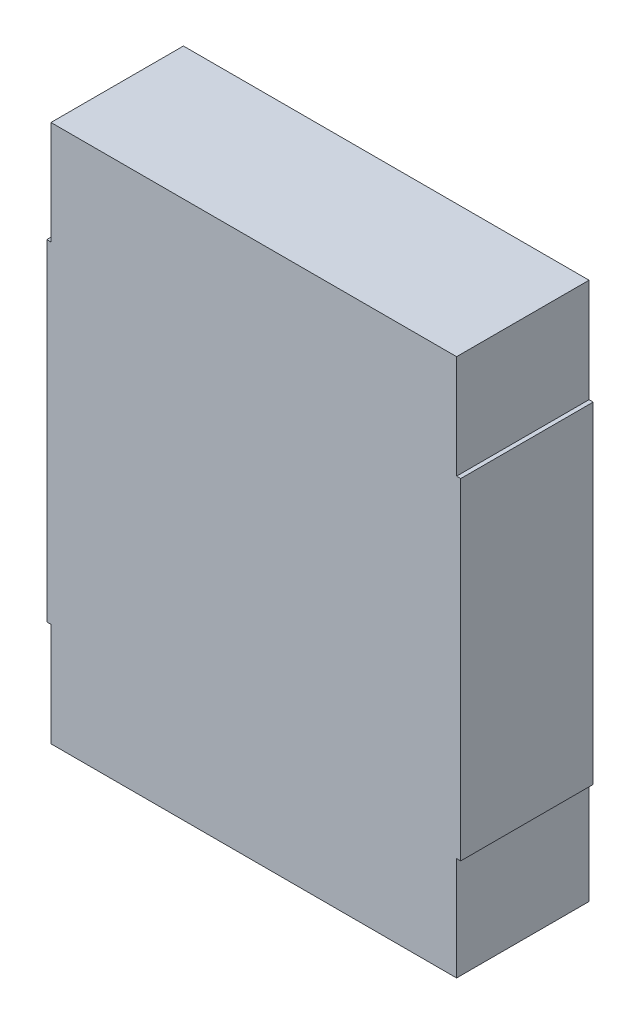
ISO-10303-21;
HEADER;
FILE_DESCRIPTION(('STEP AP214'),'2;1');
FILE_NAME('part.step','',(''),(''),'','','');
FILE_SCHEMA(('AUTOMOTIVE_DESIGN { 1 0 10303 214 1 1 1 1 }'));
ENDSEC;
DATA;
#1=APPLICATION_CONTEXT('core data for automotive mechanical design processes');
#2=APPLICATION_PROTOCOL_DEFINITION('international standard','automotive_design',2000,#1);
#3=PRODUCT_CONTEXT('',#1,'mechanical');
#4=PRODUCT('Part','Part','',(#3));
#5=PRODUCT_RELATED_PRODUCT_CATEGORY('part','',(#4));
#6=PRODUCT_DEFINITION_FORMATION('','',#4);
#7=PRODUCT_DEFINITION_CONTEXT('part definition',#1,'design');
#8=PRODUCT_DEFINITION('design','',#6,#7);
#9=PRODUCT_DEFINITION_SHAPE('','',#8);
#10=(LENGTH_UNIT() NAMED_UNIT(*) SI_UNIT(.MILLI.,.METRE.));
#11=(NAMED_UNIT(*) PLANE_ANGLE_UNIT() SI_UNIT($,.RADIAN.));
#12=(NAMED_UNIT(*) SI_UNIT($,.STERADIAN.) SOLID_ANGLE_UNIT());
#13=UNCERTAINTY_MEASURE_WITH_UNIT(LENGTH_MEASURE(1.E-05),#10,'distance_accuracy_value','');
#14=(GEOMETRIC_REPRESENTATION_CONTEXT(3) GLOBAL_UNCERTAINTY_ASSIGNED_CONTEXT((#13)) GLOBAL_UNIT_ASSIGNED_CONTEXT((#10,
#11,#12)) REPRESENTATION_CONTEXT('',''));
#15=CARTESIAN_POINT('',(0.,0.,0.));
#16=DIRECTION('',(0.,0.,1.));
#17=DIRECTION('',(1.,0.,0.));
#18=AXIS2_PLACEMENT_3D('',#15,#16,#17);
#19=CARTESIAN_POINT('',(-2.5,-2.,1.6));
#20=DIRECTION('',(1.,0.,0.));
#21=DIRECTION('',(0.,0.,-1.));
#22=AXIS2_PLACEMENT_3D('',#19,#20,#21);
#23=PLANE('',#22);
#24=DIRECTION('',(0.,-1.,0.));
#25=VECTOR('',#24,1.);
#26=CARTESIAN_POINT('',(-2.5,-2.,0.));
#27=LINE('',#26,#25);
#28=CARTESIAN_POINT('',(-2.5,2.,0.));
#29=VERTEX_POINT('',#28);
#30=CARTESIAN_POINT('',(-2.5,-2.,0.));
#31=VERTEX_POINT('',#30);
#32=EDGE_CURVE('E154',#29,#31,#27,.T.);
#33=ORIENTED_EDGE('',*,*,#32,.T.);
#34=DIRECTION('',(0.,0.,-1.));
#35=VECTOR('',#34,1.);
#36=CARTESIAN_POINT('',(-2.5,-2.,1.6));
#37=LINE('',#36,#35);
#38=CARTESIAN_POINT('',(-2.5,-2.,1.6));
#39=VERTEX_POINT('',#38);
#40=EDGE_CURVE('E11',#39,#31,#37,.T.);
#41=ORIENTED_EDGE('',*,*,#40,.F.);
#42=DIRECTION('',(0.,-1.,0.));
#43=VECTOR('',#42,1.);
#44=CARTESIAN_POINT('',(-2.5,-2.,1.6));
#45=LINE('',#44,#43);
#46=CARTESIAN_POINT('',(-2.5,2.,1.6));
#47=VERTEX_POINT('',#46);
#48=EDGE_CURVE('E176',#47,#39,#45,.T.);
#49=ORIENTED_EDGE('',*,*,#48,.F.);
#50=DIRECTION('',(0.,0.,-1.));
#51=VECTOR('',#50,1.);
#52=CARTESIAN_POINT('',(-2.5,2.,1.6));
#53=LINE('',#52,#51);
#54=EDGE_CURVE('E150',#47,#29,#53,.T.);
#55=ORIENTED_EDGE('',*,*,#54,.T.);
#56=EDGE_LOOP('',(#33,#41,#49,#55));
#57=FACE_BOUND('',#56,.T.);
#58=ADVANCED_FACE('F34',(#57),#23,.F.);
#59=CARTESIAN_POINT('',(-2.45,-2.,1.6));
#60=DIRECTION('',(0.,1.,0.));
#61=DIRECTION('',(0.,0.,1.));
#62=AXIS2_PLACEMENT_3D('',#59,#60,#61);
#63=PLANE('',#62);
#64=DIRECTION('',(1.,0.,0.));
#65=VECTOR('',#64,1.);
#66=CARTESIAN_POINT('',(-2.45,-2.,0.));
#67=LINE('',#66,#65);
#68=CARTESIAN_POINT('',(-2.45,-2.,0.));
#69=VERTEX_POINT('',#68);
#70=EDGE_CURVE('E157',#31,#69,#67,.T.);
#71=ORIENTED_EDGE('',*,*,#70,.T.);
#72=DIRECTION('',(0.,0.,-1.));
#73=VECTOR('',#72,1.);
#74=CARTESIAN_POINT('',(-2.45,-2.,1.6));
#75=LINE('',#74,#73);
#76=CARTESIAN_POINT('',(-2.45,-2.,1.6));
#77=VERTEX_POINT('',#76);
#78=EDGE_CURVE('E42',#77,#69,#75,.T.);
#79=ORIENTED_EDGE('',*,*,#78,.F.);
#80=DIRECTION('',(1.,0.,0.));
#81=VECTOR('',#80,1.);
#82=CARTESIAN_POINT('',(-2.45,-2.,1.6));
#83=LINE('',#82,#81);
#84=EDGE_CURVE('E105',#39,#77,#83,.T.);
#85=ORIENTED_EDGE('',*,*,#84,.F.);
#86=ORIENTED_EDGE('',*,*,#40,.T.);
#87=EDGE_LOOP('',(#71,#79,#85,#86));
#88=FACE_BOUND('',#87,.T.);
#89=ADVANCED_FACE('F254',(#88),#63,.F.);
#90=CARTESIAN_POINT('',(-2.45,-3.25,1.6));
#91=DIRECTION('',(1.,0.,0.));
#92=DIRECTION('',(0.,0.,-1.));
#93=AXIS2_PLACEMENT_3D('',#90,#91,#92);
#94=PLANE('',#93);
#95=DIRECTION('',(0.,-1.,0.));
#96=VECTOR('',#95,1.);
#97=CARTESIAN_POINT('',(-2.45,-3.25,0.));
#98=LINE('',#97,#96);
#99=CARTESIAN_POINT('',(-2.45,-3.25,0.));
#100=VERTEX_POINT('',#99);
#101=EDGE_CURVE('E159',#69,#100,#98,.T.);
#102=ORIENTED_EDGE('',*,*,#101,.T.);
#103=DIRECTION('',(0.,0.,-1.));
#104=VECTOR('',#103,1.);
#105=CARTESIAN_POINT('',(-2.45,-3.25,1.6));
#106=LINE('',#105,#104);
#107=CARTESIAN_POINT('',(-2.45,-3.25,1.6));
#108=VERTEX_POINT('',#107);
#109=EDGE_CURVE('E195',#108,#100,#106,.T.);
#110=ORIENTED_EDGE('',*,*,#109,.F.);
#111=DIRECTION('',(0.,-1.,0.));
#112=VECTOR('',#111,1.);
#113=CARTESIAN_POINT('',(-2.45,-3.25,1.6));
#114=LINE('',#113,#112);
#115=EDGE_CURVE('E203',#77,#108,#114,.T.);
#116=ORIENTED_EDGE('',*,*,#115,.F.);
#117=ORIENTED_EDGE('',*,*,#78,.T.);
#118=EDGE_LOOP('',(#102,#110,#116,#117));
#119=FACE_BOUND('',#118,.T.);
#120=ADVANCED_FACE('F201',(#119),#94,.F.);
#121=CARTESIAN_POINT('',(2.45,-3.25,1.6));
#122=DIRECTION('',(0.,1.,0.));
#123=DIRECTION('',(0.,0.,1.));
#124=AXIS2_PLACEMENT_3D('',#121,#122,#123);
#125=PLANE('',#124);
#126=DIRECTION('',(1.,0.,0.));
#127=VECTOR('',#126,1.);
#128=CARTESIAN_POINT('',(2.45,-3.25,0.));
#129=LINE('',#128,#127);
#130=CARTESIAN_POINT('',(2.45,-3.25,0.));
#131=VERTEX_POINT('',#130);
#132=EDGE_CURVE('E161',#100,#131,#129,.T.);
#133=ORIENTED_EDGE('',*,*,#132,.T.);
#134=DIRECTION('',(0.,0.,-1.));
#135=VECTOR('',#134,1.);
#136=CARTESIAN_POINT('',(2.45,-3.25,1.6));
#137=LINE('',#136,#135);
#138=CARTESIAN_POINT('',(2.45,-3.25,1.6));
#139=VERTEX_POINT('',#138);
#140=EDGE_CURVE('E192',#139,#131,#137,.T.);
#141=ORIENTED_EDGE('',*,*,#140,.F.);
#142=DIRECTION('',(1.,0.,0.));
#143=VECTOR('',#142,1.);
#144=CARTESIAN_POINT('',(2.45,-3.25,1.6));
#145=LINE('',#144,#143);
#146=EDGE_CURVE('E221',#108,#139,#145,.T.);
#147=ORIENTED_EDGE('',*,*,#146,.F.);
#148=ORIENTED_EDGE('',*,*,#109,.T.);
#149=EDGE_LOOP('',(#133,#141,#147,#148));
#150=FACE_BOUND('',#149,.T.);
#151=ADVANCED_FACE('F212',(#150),#125,.F.);
#152=CARTESIAN_POINT('',(2.45,-2.,1.6));
#153=DIRECTION('',(-1.,0.,0.));
#154=DIRECTION('',(0.,0.,1.));
#155=AXIS2_PLACEMENT_3D('',#152,#153,#154);
#156=PLANE('',#155);
#157=DIRECTION('',(0.,1.,0.));
#158=VECTOR('',#157,1.);
#159=CARTESIAN_POINT('',(2.45,-2.,0.));
#160=LINE('',#159,#158);
#161=CARTESIAN_POINT('',(2.45,-2.,0.));
#162=VERTEX_POINT('',#161);
#163=EDGE_CURVE('E163',#131,#162,#160,.T.);
#164=ORIENTED_EDGE('',*,*,#163,.T.);
#165=DIRECTION('',(0.,0.,-1.));
#166=VECTOR('',#165,1.);
#167=CARTESIAN_POINT('',(2.45,-2.,1.6));
#168=LINE('',#167,#166);
#169=CARTESIAN_POINT('',(2.45,-2.,1.6));
#170=VERTEX_POINT('',#169);
#171=EDGE_CURVE('E189',#170,#162,#168,.T.);
#172=ORIENTED_EDGE('',*,*,#171,.F.);
#173=DIRECTION('',(0.,1.,0.));
#174=VECTOR('',#173,1.);
#175=CARTESIAN_POINT('',(2.45,-2.,1.6));
#176=LINE('',#175,#174);
#177=EDGE_CURVE('E218',#139,#170,#176,.T.);
#178=ORIENTED_EDGE('',*,*,#177,.F.);
#179=ORIENTED_EDGE('',*,*,#140,.T.);
#180=EDGE_LOOP('',(#164,#172,#178,#179));
#181=FACE_BOUND('',#180,.T.);
#182=ADVANCED_FACE('F216',(#181),#156,.F.);
#183=CARTESIAN_POINT('',(2.5,-2.,1.6));
#184=DIRECTION('',(0.,1.,0.));
#185=DIRECTION('',(0.,0.,1.));
#186=AXIS2_PLACEMENT_3D('',#183,#184,#185);
#187=PLANE('',#186);
#188=DIRECTION('',(1.,0.,0.));
#189=VECTOR('',#188,1.);
#190=CARTESIAN_POINT('',(2.5,-2.,0.));
#191=LINE('',#190,#189);
#192=CARTESIAN_POINT('',(2.5,-2.,0.));
#193=VERTEX_POINT('',#192);
#194=EDGE_CURVE('E165',#162,#193,#191,.T.);
#195=ORIENTED_EDGE('',*,*,#194,.T.);
#196=DIRECTION('',(0.,0.,-1.));
#197=VECTOR('',#196,1.);
#198=CARTESIAN_POINT('',(2.5,-2.,1.6));
#199=LINE('',#198,#197);
#200=CARTESIAN_POINT('',(2.5,-2.,1.6));
#201=VERTEX_POINT('',#200);
#202=EDGE_CURVE('E186',#201,#193,#199,.T.);
#203=ORIENTED_EDGE('',*,*,#202,.F.);
#204=DIRECTION('',(1.,0.,0.));
#205=VECTOR('',#204,1.);
#206=CARTESIAN_POINT('',(2.5,-2.,1.6));
#207=LINE('',#206,#205);
#208=EDGE_CURVE('E220',#170,#201,#207,.T.);
#209=ORIENTED_EDGE('',*,*,#208,.F.);
#210=ORIENTED_EDGE('',*,*,#171,.T.);
#211=EDGE_LOOP('',(#195,#203,#209,#210));
#212=FACE_BOUND('',#211,.T.);
#213=ADVANCED_FACE('F267',(#212),#187,.F.);
#214=CARTESIAN_POINT('',(2.5,2.,1.6));
#215=DIRECTION('',(-1.,0.,0.));
#216=DIRECTION('',(0.,0.,1.));
#217=AXIS2_PLACEMENT_3D('',#214,#215,#216);
#218=PLANE('',#217);
#219=DIRECTION('',(0.,1.,0.));
#220=VECTOR('',#219,1.);
#221=CARTESIAN_POINT('',(2.5,2.,0.));
#222=LINE('',#221,#220);
#223=CARTESIAN_POINT('',(2.5,2.,0.));
#224=VERTEX_POINT('',#223);
#225=EDGE_CURVE('E167',#193,#224,#222,.T.);
#226=ORIENTED_EDGE('',*,*,#225,.T.);
#227=DIRECTION('',(0.,0.,-1.));
#228=VECTOR('',#227,1.);
#229=CARTESIAN_POINT('',(2.5,2.,1.6));
#230=LINE('',#229,#228);
#231=CARTESIAN_POINT('',(2.5,2.,1.6));
#232=VERTEX_POINT('',#231);
#233=EDGE_CURVE('E183',#232,#224,#230,.T.);
#234=ORIENTED_EDGE('',*,*,#233,.F.);
#235=DIRECTION('',(0.,1.,0.));
#236=VECTOR('',#235,1.);
#237=CARTESIAN_POINT('',(2.5,2.,1.6));
#238=LINE('',#237,#236);
#239=EDGE_CURVE('E223',#201,#232,#238,.T.);
#240=ORIENTED_EDGE('',*,*,#239,.F.);
#241=ORIENTED_EDGE('',*,*,#202,.T.);
#242=EDGE_LOOP('',(#226,#234,#240,#241));
#243=FACE_BOUND('',#242,.T.);
#244=ADVANCED_FACE('F270',(#243),#218,.F.);
#245=CARTESIAN_POINT('',(2.45,2.,1.6));
#246=DIRECTION('',(0.,-1.,0.));
#247=DIRECTION('',(0.,0.,-1.));
#248=AXIS2_PLACEMENT_3D('',#245,#246,#247);
#249=PLANE('',#248);
#250=DIRECTION('',(-1.,0.,0.));
#251=VECTOR('',#250,1.);
#252=CARTESIAN_POINT('',(2.45,2.,0.));
#253=LINE('',#252,#251);
#254=CARTESIAN_POINT('',(2.45,2.,0.));
#255=VERTEX_POINT('',#254);
#256=EDGE_CURVE('E169',#224,#255,#253,.T.);
#257=ORIENTED_EDGE('',*,*,#256,.T.);
#258=DIRECTION('',(0.,0.,-1.));
#259=VECTOR('',#258,1.);
#260=CARTESIAN_POINT('',(2.45,2.,1.6));
#261=LINE('',#260,#259);
#262=CARTESIAN_POINT('',(2.45,2.,1.6));
#263=VERTEX_POINT('',#262);
#264=EDGE_CURVE('E180',#263,#255,#261,.T.);
#265=ORIENTED_EDGE('',*,*,#264,.F.);
#266=DIRECTION('',(-1.,0.,0.));
#267=VECTOR('',#266,1.);
#268=CARTESIAN_POINT('',(2.45,2.,1.6));
#269=LINE('',#268,#267);
#270=EDGE_CURVE('E229',#232,#263,#269,.T.);
#271=ORIENTED_EDGE('',*,*,#270,.F.);
#272=ORIENTED_EDGE('',*,*,#233,.T.);
#273=EDGE_LOOP('',(#257,#265,#271,#272));
#274=FACE_BOUND('',#273,.T.);
#275=ADVANCED_FACE('F235',(#274),#249,.F.);
#276=CARTESIAN_POINT('',(2.45,3.25,1.6));
#277=DIRECTION('',(-1.,0.,0.));
#278=DIRECTION('',(0.,0.,1.));
#279=AXIS2_PLACEMENT_3D('',#276,#277,#278);
#280=PLANE('',#279);
#281=DIRECTION('',(0.,1.,0.));
#282=VECTOR('',#281,1.);
#283=CARTESIAN_POINT('',(2.45,3.25,0.));
#284=LINE('',#283,#282);
#285=CARTESIAN_POINT('',(2.45,3.25,0.));
#286=VERTEX_POINT('',#285);
#287=EDGE_CURVE('E171',#255,#286,#284,.T.);
#288=ORIENTED_EDGE('',*,*,#287,.T.);
#289=DIRECTION('',(0.,0.,-1.));
#290=VECTOR('',#289,1.);
#291=CARTESIAN_POINT('',(2.45,3.25,1.6));
#292=LINE('',#291,#290);
#293=CARTESIAN_POINT('',(2.45,3.25,1.6));
#294=VERTEX_POINT('',#293);
#295=EDGE_CURVE('E145',#294,#286,#292,.T.);
#296=ORIENTED_EDGE('',*,*,#295,.F.);
#297=DIRECTION('',(0.,1.,0.));
#298=VECTOR('',#297,1.);
#299=CARTESIAN_POINT('',(2.45,3.25,1.6));
#300=LINE('',#299,#298);
#301=EDGE_CURVE('E136',#263,#294,#300,.T.);
#302=ORIENTED_EDGE('',*,*,#301,.F.);
#303=ORIENTED_EDGE('',*,*,#264,.T.);
#304=EDGE_LOOP('',(#288,#296,#302,#303));
#305=FACE_BOUND('',#304,.T.);
#306=ADVANCED_FACE('F239',(#305),#280,.F.);
#307=CARTESIAN_POINT('',(-2.45,3.25,1.6));
#308=DIRECTION('',(0.,-1.,0.));
#309=DIRECTION('',(0.,0.,-1.));
#310=AXIS2_PLACEMENT_3D('',#307,#308,#309);
#311=PLANE('',#310);
#312=DIRECTION('',(-1.,0.,0.));
#313=VECTOR('',#312,1.);
#314=CARTESIAN_POINT('',(-2.45,3.25,0.));
#315=LINE('',#314,#313);
#316=CARTESIAN_POINT('',(-2.45,3.25,0.));
#317=VERTEX_POINT('',#316);
#318=EDGE_CURVE('E144',#286,#317,#315,.T.);
#319=ORIENTED_EDGE('',*,*,#318,.T.);
#320=DIRECTION('',(0.,0.,-1.));
#321=VECTOR('',#320,1.);
#322=CARTESIAN_POINT('',(-2.45,3.25,1.6));
#323=LINE('',#322,#321);
#324=CARTESIAN_POINT('',(-2.45,3.25,1.6));
#325=VERTEX_POINT('',#324);
#326=EDGE_CURVE('E141',#325,#317,#323,.T.);
#327=ORIENTED_EDGE('',*,*,#326,.F.);
#328=DIRECTION('',(-1.,0.,0.));
#329=VECTOR('',#328,1.);
#330=CARTESIAN_POINT('',(-2.45,3.25,1.6));
#331=LINE('',#330,#329);
#332=EDGE_CURVE('E130',#294,#325,#331,.T.);
#333=ORIENTED_EDGE('',*,*,#332,.F.);
#334=ORIENTED_EDGE('',*,*,#295,.T.);
#335=EDGE_LOOP('',(#319,#327,#333,#334));
#336=FACE_BOUND('',#335,.T.);
#337=ADVANCED_FACE('F142',(#336),#311,.F.);
#338=CARTESIAN_POINT('',(-2.45,2.,1.6));
#339=DIRECTION('',(1.,0.,0.));
#340=DIRECTION('',(0.,0.,-1.));
#341=AXIS2_PLACEMENT_3D('',#338,#339,#340);
#342=PLANE('',#341);
#343=DIRECTION('',(0.,-1.,0.));
#344=VECTOR('',#343,1.);
#345=CARTESIAN_POINT('',(-2.45,2.,0.));
#346=LINE('',#345,#344);
#347=CARTESIAN_POINT('',(-2.45,2.,0.));
#348=VERTEX_POINT('',#347);
#349=EDGE_CURVE('E91',#317,#348,#346,.T.);
#350=ORIENTED_EDGE('',*,*,#349,.T.);
#351=DIRECTION('',(0.,0.,-1.));
#352=VECTOR('',#351,1.);
#353=CARTESIAN_POINT('',(-2.45,2.,1.6));
#354=LINE('',#353,#352);
#355=CARTESIAN_POINT('',(-2.45,2.,1.6));
#356=VERTEX_POINT('',#355);
#357=EDGE_CURVE('E146',#356,#348,#354,.T.);
#358=ORIENTED_EDGE('',*,*,#357,.F.);
#359=DIRECTION('',(0.,-1.,0.));
#360=VECTOR('',#359,1.);
#361=CARTESIAN_POINT('',(-2.45,2.,1.6));
#362=LINE('',#361,#360);
#363=EDGE_CURVE('E134',#325,#356,#362,.T.);
#364=ORIENTED_EDGE('',*,*,#363,.F.);
#365=ORIENTED_EDGE('',*,*,#326,.T.);
#366=EDGE_LOOP('',(#350,#358,#364,#365));
#367=FACE_BOUND('',#366,.T.);
#368=ADVANCED_FACE('F148',(#367),#342,.F.);
#369=CARTESIAN_POINT('',(-2.5,2.,1.6));
#370=DIRECTION('',(0.,-1.,0.));
#371=DIRECTION('',(0.,0.,-1.));
#372=AXIS2_PLACEMENT_3D('',#369,#370,#371);
#373=PLANE('',#372);
#374=DIRECTION('',(-1.,0.,0.));
#375=VECTOR('',#374,1.);
#376=CARTESIAN_POINT('',(-2.5,2.,0.));
#377=LINE('',#376,#375);
#378=EDGE_CURVE('E97',#348,#29,#377,.T.);
#379=ORIENTED_EDGE('',*,*,#378,.T.);
#380=ORIENTED_EDGE('',*,*,#54,.F.);
#381=DIRECTION('',(-1.,0.,0.));
#382=VECTOR('',#381,1.);
#383=CARTESIAN_POINT('',(-2.5,2.,1.6));
#384=LINE('',#383,#382);
#385=EDGE_CURVE('E50',#356,#47,#384,.T.);
#386=ORIENTED_EDGE('',*,*,#385,.F.);
#387=ORIENTED_EDGE('',*,*,#357,.T.);
#388=EDGE_LOOP('',(#379,#380,#386,#387));
#389=FACE_BOUND('',#388,.T.);
#390=ADVANCED_FACE('F243',(#389),#373,.F.);
#391=CARTESIAN_POINT('',(0.,0.,1.6));
#392=DIRECTION('',(0.,0.,-1.));
#393=DIRECTION('',(-1.,0.,0.));
#394=AXIS2_PLACEMENT_3D('',#391,#392,#393);
#395=PLANE('',#394);
#396=ORIENTED_EDGE('',*,*,#48,.T.);
#397=ORIENTED_EDGE('',*,*,#84,.T.);
#398=ORIENTED_EDGE('',*,*,#115,.T.);
#399=ORIENTED_EDGE('',*,*,#146,.T.);
#400=ORIENTED_EDGE('',*,*,#177,.T.);
#401=ORIENTED_EDGE('',*,*,#208,.T.);
#402=ORIENTED_EDGE('',*,*,#239,.T.);
#403=ORIENTED_EDGE('',*,*,#270,.T.);
#404=ORIENTED_EDGE('',*,*,#301,.T.);
#405=ORIENTED_EDGE('',*,*,#332,.T.);
#406=ORIENTED_EDGE('',*,*,#363,.T.);
#407=ORIENTED_EDGE('',*,*,#385,.T.);
#408=EDGE_LOOP('',(#396,#397,#398,#399,#400,#401,#402,#403,#404,#405,#406,#407));
#409=FACE_BOUND('',#408,.T.);
#410=ADVANCED_FACE('F132',(#409),#395,.F.);
#411=CARTESIAN_POINT('',(0.,0.,0.));
#412=DIRECTION('',(0.,0.,-1.));
#413=DIRECTION('',(-1.,0.,0.));
#414=AXIS2_PLACEMENT_3D('',#411,#412,#413);
#415=PLANE('',#414);
#416=ORIENTED_EDGE('',*,*,#32,.F.);
#417=ORIENTED_EDGE('',*,*,#378,.F.);
#418=ORIENTED_EDGE('',*,*,#349,.F.);
#419=ORIENTED_EDGE('',*,*,#318,.F.);
#420=ORIENTED_EDGE('',*,*,#287,.F.);
#421=ORIENTED_EDGE('',*,*,#256,.F.);
#422=ORIENTED_EDGE('',*,*,#225,.F.);
#423=ORIENTED_EDGE('',*,*,#194,.F.);
#424=ORIENTED_EDGE('',*,*,#163,.F.);
#425=ORIENTED_EDGE('',*,*,#132,.F.);
#426=ORIENTED_EDGE('',*,*,#101,.F.);
#427=ORIENTED_EDGE('',*,*,#70,.F.);
#428=EDGE_LOOP('',(#416,#417,#418,#419,#420,#421,#422,#423,#424,#425,#426,#427));
#429=FACE_BOUND('',#428,.T.);
#430=ADVANCED_FACE('F207',(#429),#415,.T.);
#431=CLOSED_SHELL('',(#58,#89,#120,#151,#182,#213,#244,#275,#306,#337,#368,#390,#410,#430));
#432=MANIFOLD_SOLID_BREP('B2',#431);
#433=ADVANCED_BREP_SHAPE_REPRESENTATION('',(#18,#432),#14);
#434=SHAPE_DEFINITION_REPRESENTATION(#9,#433);
ENDSEC;
END-ISO-10303-21;
